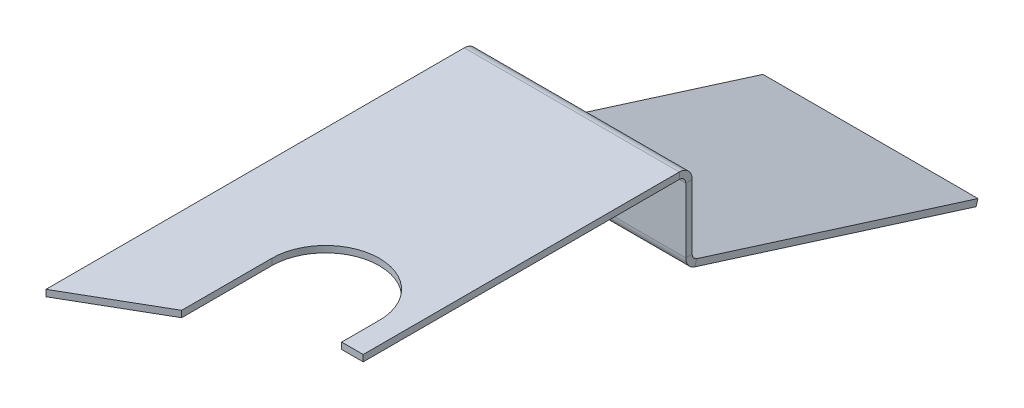
ISO-10303-21;
HEADER;
FILE_DESCRIPTION(('STEP AP214'),'2;1');
FILE_NAME('part.step','',(''),(''),'','','');
FILE_SCHEMA(('AUTOMOTIVE_DESIGN { 1 0 10303 214 1 1 1 1 }'));
ENDSEC;
DATA;
#1=APPLICATION_CONTEXT('core data for automotive mechanical design processes');
#2=APPLICATION_PROTOCOL_DEFINITION('international standard','automotive_design',2000,#1);
#3=PRODUCT_CONTEXT('',#1,'mechanical');
#4=PRODUCT('Part','Part','',(#3));
#5=PRODUCT_RELATED_PRODUCT_CATEGORY('part','',(#4));
#6=PRODUCT_DEFINITION_FORMATION('','',#4);
#7=PRODUCT_DEFINITION_CONTEXT('part definition',#1,'design');
#8=PRODUCT_DEFINITION('design','',#6,#7);
#9=PRODUCT_DEFINITION_SHAPE('','',#8);
#10=(LENGTH_UNIT() NAMED_UNIT(*) SI_UNIT(.MILLI.,.METRE.));
#11=(NAMED_UNIT(*) PLANE_ANGLE_UNIT() SI_UNIT($,.RADIAN.));
#12=(NAMED_UNIT(*) SI_UNIT($,.STERADIAN.) SOLID_ANGLE_UNIT());
#13=UNCERTAINTY_MEASURE_WITH_UNIT(LENGTH_MEASURE(1.E-05),#10,'distance_accuracy_value','');
#14=(GEOMETRIC_REPRESENTATION_CONTEXT(3) GLOBAL_UNCERTAINTY_ASSIGNED_CONTEXT((#13)) GLOBAL_UNIT_ASSIGNED_CONTEXT((#10,
#11,#12)) REPRESENTATION_CONTEXT('',''));
#15=CARTESIAN_POINT('',(0.,0.,0.));
#16=DIRECTION('',(0.,0.,1.));
#17=DIRECTION('',(1.,0.,0.));
#18=AXIS2_PLACEMENT_3D('',#15,#16,#17);
#19=CARTESIAN_POINT('',(100.,-6.,-401.));
#20=DIRECTION('',(1.,0.,0.));
#21=DIRECTION('',(0.,0.,-1.));
#22=AXIS2_PLACEMENT_3D('',#19,#20,#21);
#23=PLANE('',#22);
#24=DIRECTION('',(0.,0.,-1.));
#25=VECTOR('',#24,1.);
#26=CARTESIAN_POINT('',(100.,6.,0.));
#27=LINE('',#26,#25);
#28=CARTESIAN_POINT('',(100.,6.,-95.));
#29=VERTEX_POINT('',#28);
#30=CARTESIAN_POINT('',(100.,6.,-388.999999999999));
#31=VERTEX_POINT('',#30);
#32=EDGE_CURVE('E252',#29,#31,#27,.T.);
#33=ORIENTED_EDGE('',*,*,#32,.F.);
#34=DIRECTION('',(0.,-1.,0.));
#35=VECTOR('',#34,1.);
#36=CARTESIAN_POINT('',(100.,0.,-95.));
#37=LINE('',#36,#35);
#38=CARTESIAN_POINT('',(100.,0.,-95.));
#39=VERTEX_POINT('',#38);
#40=EDGE_CURVE('E263',#39,#29,#37,.F.);
#41=ORIENTED_EDGE('',*,*,#40,.F.);
#42=DIRECTION('',(0.,0.,-1.));
#43=VECTOR('',#42,1.);
#44=CARTESIAN_POINT('',(100.,0.,0.));
#45=LINE('',#44,#43);
#46=CARTESIAN_POINT('',(100.,0.,-389.));
#47=VERTEX_POINT('',#46);
#48=EDGE_CURVE('E151',#39,#47,#45,.T.);
#49=ORIENTED_EDGE('',*,*,#48,.T.);
#50=DIRECTION('',(0.,1.,0.));
#51=VECTOR('',#50,1.);
#52=CARTESIAN_POINT('',(100.,0.,-389.));
#53=LINE('',#52,#51);
#54=EDGE_CURVE('E11',#47,#31,#53,.T.);
#55=ORIENTED_EDGE('',*,*,#54,.T.);
#56=EDGE_LOOP('',(#33,#41,#49,#55));
#57=FACE_BOUND('',#56,.T.);
#58=ADVANCED_FACE('F38',(#57),#23,.T.);
#59=CARTESIAN_POINT('',(100.,6.,0.));
#60=DIRECTION('',(0.,1.,0.));
#61=DIRECTION('',(0.,0.,1.));
#62=AXIS2_PLACEMENT_3D('',#59,#60,#61);
#63=PLANE('',#62);
#64=DIRECTION('',(0.,0.,1.));
#65=VECTOR('',#64,1.);
#66=CARTESIAN_POINT('',(80.,6.,0.));
#67=LINE('',#66,#65);
#68=CARTESIAN_POINT('',(80.,6.,-130.));
#69=VERTEX_POINT('',#68);
#70=CARTESIAN_POINT('',(80.,6.,-95.));
#71=VERTEX_POINT('',#70);
#72=EDGE_CURVE('E305',#69,#71,#67,.T.);
#73=ORIENTED_EDGE('',*,*,#72,.T.);
#74=DIRECTION('',(1.,0.,0.));
#75=VECTOR('',#74,1.);
#76=CARTESIAN_POINT('',(100.,6.,-95.));
#77=LINE('',#76,#75);
#78=EDGE_CURVE('E299',#71,#29,#77,.T.);
#79=ORIENTED_EDGE('',*,*,#78,.T.);
#80=ORIENTED_EDGE('',*,*,#32,.T.);
#81=DIRECTION('',(-1.,0.,0.));
#82=VECTOR('',#81,1.);
#83=CARTESIAN_POINT('',(100.,6.,-388.999999999999));
#84=LINE('',#83,#82);
#85=CARTESIAN_POINT('',(-100.,6.,-388.999999999999));
#86=VERTEX_POINT('',#85);
#87=EDGE_CURVE('E207',#31,#86,#84,.T.);
#88=ORIENTED_EDGE('',*,*,#87,.T.);
#89=DIRECTION('',(0.,0.,-1.));
#90=VECTOR('',#89,1.);
#91=CARTESIAN_POINT('',(-100.,6.,0.));
#92=LINE('',#91,#90);
#93=CARTESIAN_POINT('',(-100.,6.,0.));
#94=VERTEX_POINT('',#93);
#95=EDGE_CURVE('E189',#94,#86,#92,.T.);
#96=ORIENTED_EDGE('',*,*,#95,.F.);
#97=DIRECTION('',(0.86602540378444,0.,-0.499999999999998));
#98=VECTOR('',#97,1.);
#99=CARTESIAN_POINT('',(-20.,6.,-46.1880215351698));
#100=LINE('',#99,#98);
#101=CARTESIAN_POINT('',(-20.,6.,-46.1880215351698));
#102=VERTEX_POINT('',#101);
#103=EDGE_CURVE('E312',#94,#102,#100,.T.);
#104=ORIENTED_EDGE('',*,*,#103,.T.);
#105=DIRECTION('',(0.,0.,1.));
#106=VECTOR('',#105,1.);
#107=CARTESIAN_POINT('',(-20.,6.,0.));
#108=LINE('',#107,#106);
#109=CARTESIAN_POINT('',(-20.,6.,-130.));
#110=VERTEX_POINT('',#109);
#111=EDGE_CURVE('E315',#102,#110,#108,.F.);
#112=ORIENTED_EDGE('',*,*,#111,.T.);
#113=CARTESIAN_POINT('',(30.,6.,-130.));
#114=DIRECTION('',(0.,1.,0.));
#115=DIRECTION('',(0.,0.,1.));
#116=AXIS2_PLACEMENT_3D('',#113,#114,#115);
#117=CIRCLE('',#116,50.);
#118=EDGE_CURVE('E309',#110,#69,#117,.F.);
#119=ORIENTED_EDGE('',*,*,#118,.T.);
#120=EDGE_LOOP('',(#73,#79,#80,#88,#96,#104,#112,#119));
#121=FACE_BOUND('',#120,.T.);
#122=ADVANCED_FACE('F248',(#121),#63,.T.);
#123=CARTESIAN_POINT('',(100.,0.,0.));
#124=DIRECTION('',(0.,1.,0.));
#125=DIRECTION('',(0.,0.,1.));
#126=AXIS2_PLACEMENT_3D('',#123,#124,#125);
#127=PLANE('',#126);
#128=DIRECTION('',(1.,0.,0.));
#129=VECTOR('',#128,1.);
#130=CARTESIAN_POINT('',(80.,0.,-95.));
#131=LINE('',#130,#129);
#132=CARTESIAN_POINT('',(80.,0.,-95.));
#133=VERTEX_POINT('',#132);
#134=EDGE_CURVE('E270',#133,#39,#131,.T.);
#135=ORIENTED_EDGE('',*,*,#134,.F.);
#136=DIRECTION('',(0.,0.,1.));
#137=VECTOR('',#136,1.);
#138=CARTESIAN_POINT('',(80.,0.,-130.));
#139=LINE('',#138,#137);
#140=CARTESIAN_POINT('',(80.,0.,-130.));
#141=VERTEX_POINT('',#140);
#142=EDGE_CURVE('E324',#141,#133,#139,.T.);
#143=ORIENTED_EDGE('',*,*,#142,.F.);
#144=CARTESIAN_POINT('',(30.,0.,-130.));
#145=DIRECTION('',(0.,1.,0.));
#146=DIRECTION('',(0.,0.,1.));
#147=AXIS2_PLACEMENT_3D('',#144,#145,#146);
#148=CIRCLE('',#147,50.);
#149=CARTESIAN_POINT('',(-20.,0.,-130.));
#150=VERTEX_POINT('',#149);
#151=EDGE_CURVE('E322',#150,#141,#148,.F.);
#152=ORIENTED_EDGE('',*,*,#151,.F.);
#153=DIRECTION('',(0.,0.,-1.));
#154=VECTOR('',#153,1.);
#155=CARTESIAN_POINT('',(-20.,0.,-130.));
#156=LINE('',#155,#154);
#157=CARTESIAN_POINT('',(-20.,0.,-46.1880215351698));
#158=VERTEX_POINT('',#157);
#159=EDGE_CURVE('E320',#158,#150,#156,.T.);
#160=ORIENTED_EDGE('',*,*,#159,.F.);
#161=DIRECTION('',(0.86602540378444,0.,-0.499999999999998));
#162=VECTOR('',#161,1.);
#163=CARTESIAN_POINT('',(-20.,0.,-46.1880215351698));
#164=LINE('',#163,#162);
#165=CARTESIAN_POINT('',(-100.,0.,0.));
#166=VERTEX_POINT('',#165);
#167=EDGE_CURVE('E318',#166,#158,#164,.T.);
#168=ORIENTED_EDGE('',*,*,#167,.F.);
#169=DIRECTION('',(0.,0.,-1.));
#170=VECTOR('',#169,1.);
#171=CARTESIAN_POINT('',(-100.,0.,0.));
#172=LINE('',#171,#170);
#173=CARTESIAN_POINT('',(-100.,0.,-389.));
#174=VERTEX_POINT('',#173);
#175=EDGE_CURVE('E195',#166,#174,#172,.T.);
#176=ORIENTED_EDGE('',*,*,#175,.T.);
#177=DIRECTION('',(-1.,0.,0.));
#178=VECTOR('',#177,1.);
#179=CARTESIAN_POINT('',(100.,0.,-389.));
#180=LINE('',#179,#178);
#181=EDGE_CURVE('E160',#47,#174,#180,.T.);
#182=ORIENTED_EDGE('',*,*,#181,.F.);
#183=ORIENTED_EDGE('',*,*,#48,.F.);
#184=EDGE_LOOP('',(#135,#143,#152,#160,#168,#176,#182,#183));
#185=FACE_BOUND('',#184,.T.);
#186=ADVANCED_FACE('F266',(#185),#127,.F.);
#187=CARTESIAN_POINT('',(100.,0.,-389.));
#188=DIRECTION('',(1.,0.,0.));
#189=DIRECTION('',(0.,0.,-1.));
#190=AXIS2_PLACEMENT_3D('',#187,#188,#189);
#191=PLANE('',#190);
#192=ORIENTED_EDGE('',*,*,#54,.F.);
#193=CARTESIAN_POINT('',(100.,-6.,-389.));
#194=DIRECTION('',(1.,0.,0.));
#195=DIRECTION('',(0.,0.,-1.));
#196=AXIS2_PLACEMENT_3D('',#193,#194,#195);
#197=CIRCLE('',#196,6.);
#198=CARTESIAN_POINT('',(100.,-6.,-395.));
#199=VERTEX_POINT('',#198);
#200=EDGE_CURVE('E146',#47,#199,#197,.F.);
#201=ORIENTED_EDGE('',*,*,#200,.T.);
#202=DIRECTION('',(0.,0.,1.));
#203=VECTOR('',#202,1.);
#204=CARTESIAN_POINT('',(100.,-6.,-401.));
#205=LINE('',#204,#203);
#206=CARTESIAN_POINT('',(100.,-6.,-401.));
#207=VERTEX_POINT('',#206);
#208=EDGE_CURVE('E47',#207,#199,#205,.T.);
#209=ORIENTED_EDGE('',*,*,#208,.F.);
#210=CARTESIAN_POINT('',(100.,-6.,-389.));
#211=DIRECTION('',(1.,0.,0.));
#212=DIRECTION('',(0.,0.,-1.));
#213=AXIS2_PLACEMENT_3D('',#210,#211,#212);
#214=CIRCLE('',#213,12.);
#215=EDGE_CURVE('E237',#31,#207,#214,.F.);
#216=ORIENTED_EDGE('',*,*,#215,.F.);
#217=EDGE_LOOP('',(#192,#201,#209,#216));
#218=FACE_BOUND('',#217,.T.);
#219=ADVANCED_FACE('F40',(#218),#191,.T.);
#220=CARTESIAN_POINT('',(-100.,-6.,-395.));
#221=DIRECTION('',(-1.,0.,0.));
#222=DIRECTION('',(0.,0.,1.));
#223=AXIS2_PLACEMENT_3D('',#220,#221,#222);
#224=PLANE('',#223);
#225=DIRECTION('',(0.,0.,-1.));
#226=VECTOR('',#225,1.);
#227=CARTESIAN_POINT('',(-100.,-6.,-395.));
#228=LINE('',#227,#226);
#229=CARTESIAN_POINT('',(-100.,-6.,-395.));
#230=VERTEX_POINT('',#229);
#231=CARTESIAN_POINT('',(-100.,-6.,-401.));
#232=VERTEX_POINT('',#231);
#233=EDGE_CURVE('E143',#230,#232,#228,.T.);
#234=ORIENTED_EDGE('',*,*,#233,.F.);
#235=CARTESIAN_POINT('',(-100.,-6.,-389.));
#236=DIRECTION('',(1.,0.,0.));
#237=DIRECTION('',(0.,0.,-1.));
#238=AXIS2_PLACEMENT_3D('',#235,#236,#237);
#239=CIRCLE('',#238,6.);
#240=EDGE_CURVE('E158',#174,#230,#239,.F.);
#241=ORIENTED_EDGE('',*,*,#240,.F.);
#242=DIRECTION('',(0.,-1.,0.));
#243=VECTOR('',#242,1.);
#244=CARTESIAN_POINT('',(-100.,6.,-388.999999999999));
#245=LINE('',#244,#243);
#246=EDGE_CURVE('E228',#86,#174,#245,.T.);
#247=ORIENTED_EDGE('',*,*,#246,.F.);
#248=CARTESIAN_POINT('',(-100.,-6.,-389.));
#249=DIRECTION('',(1.,0.,0.));
#250=DIRECTION('',(0.,0.,-1.));
#251=AXIS2_PLACEMENT_3D('',#248,#249,#250);
#252=CIRCLE('',#251,12.);
#253=EDGE_CURVE('E186',#86,#232,#252,.F.);
#254=ORIENTED_EDGE('',*,*,#253,.T.);
#255=EDGE_LOOP('',(#234,#241,#247,#254));
#256=FACE_BOUND('',#255,.T.);
#257=ADVANCED_FACE('F242',(#256),#224,.T.);
#258=CARTESIAN_POINT('',(-100.,6.,-388.999999999999));
#259=DIRECTION('',(-1.,0.,0.));
#260=DIRECTION('',(0.,0.,1.));
#261=AXIS2_PLACEMENT_3D('',#258,#259,#260);
#262=PLANE('',#261);
#263=DIRECTION('',(0.,-1.,0.));
#264=VECTOR('',#263,1.);
#265=CARTESIAN_POINT('',(-100.,0.,-395.));
#266=LINE('',#265,#264);
#267=CARTESIAN_POINT('',(-100.,-66.1971734624727,-395.));
#268=VERTEX_POINT('',#267);
#269=EDGE_CURVE('E199',#230,#268,#266,.T.);
#270=ORIENTED_EDGE('',*,*,#269,.F.);
#271=ORIENTED_EDGE('',*,*,#233,.T.);
#272=DIRECTION('',(0.,1.,0.));
#273=VECTOR('',#272,1.);
#274=CARTESIAN_POINT('',(-100.,0.,-401.));
#275=LINE('',#274,#273);
#276=CARTESIAN_POINT('',(-100.,-66.1971734624727,-401.));
#277=VERTEX_POINT('',#276);
#278=EDGE_CURVE('E184',#232,#277,#275,.F.);
#279=ORIENTED_EDGE('',*,*,#278,.T.);
#280=DIRECTION('',(0.,0.,1.));
#281=VECTOR('',#280,1.);
#282=CARTESIAN_POINT('',(-100.,-66.1971734624727,-401.));
#283=LINE('',#282,#281);
#284=EDGE_CURVE('E94',#277,#268,#283,.T.);
#285=ORIENTED_EDGE('',*,*,#284,.T.);
#286=EDGE_LOOP('',(#270,#271,#279,#285));
#287=FACE_BOUND('',#286,.T.);
#288=ADVANCED_FACE('F230',(#287),#262,.T.);
#289=CARTESIAN_POINT('',(100.,-66.1971734624727,-395.));
#290=DIRECTION('',(1.,0.,0.));
#291=DIRECTION('',(0.,0.,-1.));
#292=AXIS2_PLACEMENT_3D('',#289,#290,#291);
#293=PLANE('',#292);
#294=DIRECTION('',(0.,0.,-1.));
#295=VECTOR('',#294,1.);
#296=CARTESIAN_POINT('',(100.,-66.1971734624727,-395.));
#297=LINE('',#296,#295);
#298=CARTESIAN_POINT('',(100.,-66.1971734624727,-395.));
#299=VERTEX_POINT('',#298);
#300=CARTESIAN_POINT('',(100.,-66.1971734624727,-401.));
#301=VERTEX_POINT('',#300);
#302=EDGE_CURVE('E226',#299,#301,#297,.T.);
#303=ORIENTED_EDGE('',*,*,#302,.F.);
#304=CARTESIAN_POINT('',(100.,-66.1971734624727,-407.));
#305=DIRECTION('',(-1.,0.,0.));
#306=DIRECTION('',(0.,0.,1.));
#307=AXIS2_PLACEMENT_3D('',#304,#305,#306);
#308=CIRCLE('',#307,12.);
#309=CARTESIAN_POINT('',(100.,-77.6433644713431,-403.396569497208));
#310=VERTEX_POINT('',#309);
#311=EDGE_CURVE('E166',#299,#310,#308,.F.);
#312=ORIENTED_EDGE('',*,*,#311,.T.);
#313=DIRECTION('',(0.,-0.953849250739195,0.300285875232712));
#314=VECTOR('',#313,1.);
#315=CARTESIAN_POINT('',(100.,-71.9202689669079,-405.198284748604));
#316=LINE('',#315,#314);
#317=CARTESIAN_POINT('',(100.,-71.9202689669079,-405.198284748604));
#318=VERTEX_POINT('',#317);
#319=EDGE_CURVE('E55',#318,#310,#316,.T.);
#320=ORIENTED_EDGE('',*,*,#319,.F.);
#321=CARTESIAN_POINT('',(100.,-66.1971734624727,-407.));
#322=DIRECTION('',(1.,0.,0.));
#323=DIRECTION('',(0.,0.,-1.));
#324=AXIS2_PLACEMENT_3D('',#321,#322,#323);
#325=CIRCLE('',#324,6.);
#326=EDGE_CURVE('E255',#301,#318,#325,.T.);
#327=ORIENTED_EDGE('',*,*,#326,.F.);
#328=EDGE_LOOP('',(#303,#312,#320,#327));
#329=FACE_BOUND('',#328,.T.);
#330=ADVANCED_FACE('F346',(#329),#293,.T.);
#331=CARTESIAN_POINT('',(100.,-71.9202689669079,-405.198284748604));
#332=DIRECTION('',(1.,0.,0.));
#333=DIRECTION('',(0.,0.,-1.));
#334=AXIS2_PLACEMENT_3D('',#331,#332,#333);
#335=PLANE('',#334);
#336=DIRECTION('',(0.,-1.,0.));
#337=VECTOR('',#336,1.);
#338=CARTESIAN_POINT('',(100.,0.,-395.));
#339=LINE('',#338,#337);
#340=EDGE_CURVE('E135',#199,#299,#339,.T.);
#341=ORIENTED_EDGE('',*,*,#340,.T.);
#342=ORIENTED_EDGE('',*,*,#302,.T.);
#343=DIRECTION('',(0.,1.,0.));
#344=VECTOR('',#343,1.);
#345=CARTESIAN_POINT('',(100.,0.,-401.));
#346=LINE('',#345,#344);
#347=EDGE_CURVE('E138',#207,#301,#346,.F.);
#348=ORIENTED_EDGE('',*,*,#347,.F.);
#349=ORIENTED_EDGE('',*,*,#208,.T.);
#350=EDGE_LOOP('',(#341,#342,#348,#349));
#351=FACE_BOUND('',#350,.T.);
#352=ADVANCED_FACE('F133',(#351),#335,.T.);
#353=CARTESIAN_POINT('',(-100.,-77.6433644713431,-403.396569497208));
#354=DIRECTION('',(-1.,0.,0.));
#355=DIRECTION('',(0.,0.,1.));
#356=AXIS2_PLACEMENT_3D('',#353,#354,#355);
#357=PLANE('',#356);
#358=DIRECTION('',(0.,0.953849250739195,-0.300285875232712));
#359=VECTOR('',#358,1.);
#360=CARTESIAN_POINT('',(-100.,-77.6433644713431,-403.396569497208));
#361=LINE('',#360,#359);
#362=CARTESIAN_POINT('',(-100.,-77.6433644713431,-403.396569497208));
#363=VERTEX_POINT('',#362);
#364=CARTESIAN_POINT('',(-100.,-71.9202689669079,-405.198284748604));
#365=VERTEX_POINT('',#364);
#366=EDGE_CURVE('E101',#363,#365,#361,.T.);
#367=ORIENTED_EDGE('',*,*,#366,.F.);
#368=CARTESIAN_POINT('',(-100.,-66.1971734624727,-407.));
#369=DIRECTION('',(-1.,0.,0.));
#370=DIRECTION('',(0.,0.,1.));
#371=AXIS2_PLACEMENT_3D('',#368,#369,#370);
#372=CIRCLE('',#371,12.);
#373=EDGE_CURVE('E201',#268,#363,#372,.F.);
#374=ORIENTED_EDGE('',*,*,#373,.F.);
#375=ORIENTED_EDGE('',*,*,#284,.F.);
#376=CARTESIAN_POINT('',(-100.,-66.1971734624727,-407.));
#377=DIRECTION('',(1.,0.,0.));
#378=DIRECTION('',(0.,0.,-1.));
#379=AXIS2_PLACEMENT_3D('',#376,#377,#378);
#380=CIRCLE('',#379,6.);
#381=EDGE_CURVE('E182',#277,#365,#380,.T.);
#382=ORIENTED_EDGE('',*,*,#381,.T.);
#383=EDGE_LOOP('',(#367,#374,#375,#382));
#384=FACE_BOUND('',#383,.T.);
#385=ADVANCED_FACE('F361',(#384),#357,.T.);
#386=CARTESIAN_POINT('',(-100.,-66.1971734624727,-401.));
#387=DIRECTION('',(-1.,0.,0.));
#388=DIRECTION('',(0.,0.,1.));
#389=AXIS2_PLACEMENT_3D('',#386,#387,#388);
#390=PLANE('',#389);
#391=DIRECTION('',(0.,-0.30028587523271,-0.953849250739196));
#392=VECTOR('',#391,1.);
#393=CARTESIAN_POINT('',(-100.,-75.,-395.));
#394=LINE('',#393,#392);
#395=CARTESIAN_POINT('',(-100.,-160.,-665.));
#396=VERTEX_POINT('',#395);
#397=EDGE_CURVE('E172',#363,#396,#394,.T.);
#398=ORIENTED_EDGE('',*,*,#397,.F.);
#399=ORIENTED_EDGE('',*,*,#366,.T.);
#400=DIRECTION('',(0.,-0.30028587523271,-0.953849250739196));
#401=VECTOR('',#400,1.);
#402=CARTESIAN_POINT('',(-100.,-69.2769044955648,-396.801715251396));
#403=LINE('',#402,#401);
#404=CARTESIAN_POINT('',(-100.,-154.276904495565,-666.801715251396));
#405=VERTEX_POINT('',#404);
#406=EDGE_CURVE('E179',#365,#405,#403,.T.);
#407=ORIENTED_EDGE('',*,*,#406,.T.);
#408=DIRECTION('',(0.,-0.953849250739195,0.300285875232714));
#409=VECTOR('',#408,1.);
#410=CARTESIAN_POINT('',(-100.,-154.276904495565,-666.801715251396));
#411=LINE('',#410,#409);
#412=EDGE_CURVE('E175',#405,#396,#411,.T.);
#413=ORIENTED_EDGE('',*,*,#412,.T.);
#414=EDGE_LOOP('',(#398,#399,#407,#413));
#415=FACE_BOUND('',#414,.T.);
#416=ADVANCED_FACE('F356',(#415),#390,.T.);
#417=CARTESIAN_POINT('',(100.,-75.,-395.));
#418=DIRECTION('',(0.,0.953849250739196,-0.30028587523271));
#419=DIRECTION('',(0.,0.30028587523271,0.953849250739196));
#420=AXIS2_PLACEMENT_3D('',#417,#418,#419);
#421=PLANE('',#420);
#422=ORIENTED_EDGE('',*,*,#397,.T.);
#423=DIRECTION('',(-1.,0.,0.));
#424=VECTOR('',#423,1.);
#425=CARTESIAN_POINT('',(100.,-160.,-665.));
#426=LINE('',#425,#424);
#427=CARTESIAN_POINT('',(100.,-160.,-665.));
#428=VERTEX_POINT('',#427);
#429=EDGE_CURVE('E221',#428,#396,#426,.T.);
#430=ORIENTED_EDGE('',*,*,#429,.F.);
#431=DIRECTION('',(0.,-0.30028587523271,-0.953849250739196));
#432=VECTOR('',#431,1.);
#433=CARTESIAN_POINT('',(100.,-75.,-395.));
#434=LINE('',#433,#432);
#435=EDGE_CURVE('E107',#310,#428,#434,.T.);
#436=ORIENTED_EDGE('',*,*,#435,.F.);
#437=DIRECTION('',(-1.,0.,0.));
#438=VECTOR('',#437,1.);
#439=CARTESIAN_POINT('',(100.,-77.6433644713431,-403.396569497208));
#440=LINE('',#439,#438);
#441=EDGE_CURVE('E168',#310,#363,#440,.T.);
#442=ORIENTED_EDGE('',*,*,#441,.T.);
#443=EDGE_LOOP('',(#422,#430,#436,#442));
#444=FACE_BOUND('',#443,.T.);
#445=ADVANCED_FACE('F358',(#444),#421,.F.);
#446=CARTESIAN_POINT('',(100.,-154.276904495565,-666.801715251396));
#447=DIRECTION('',(0.,-0.300285875232714,-0.953849250739195));
#448=DIRECTION('',(0.,0.953849250739195,-0.300285875232714));
#449=AXIS2_PLACEMENT_3D('',#446,#447,#448);
#450=PLANE('',#449);
#451=ORIENTED_EDGE('',*,*,#412,.F.);
#452=DIRECTION('',(-1.,0.,0.));
#453=VECTOR('',#452,1.);
#454=CARTESIAN_POINT('',(100.,-154.276904495565,-666.801715251396));
#455=LINE('',#454,#453);
#456=CARTESIAN_POINT('',(100.,-154.276904495565,-666.801715251396));
#457=VERTEX_POINT('',#456);
#458=EDGE_CURVE('E219',#457,#405,#455,.T.);
#459=ORIENTED_EDGE('',*,*,#458,.F.);
#460=DIRECTION('',(0.,-0.953849250739195,0.300285875232714));
#461=VECTOR('',#460,1.);
#462=CARTESIAN_POINT('',(100.,-154.276904495565,-666.801715251396));
#463=LINE('',#462,#461);
#464=EDGE_CURVE('E334',#457,#428,#463,.T.);
#465=ORIENTED_EDGE('',*,*,#464,.T.);
#466=ORIENTED_EDGE('',*,*,#429,.T.);
#467=EDGE_LOOP('',(#451,#459,#465,#466));
#468=FACE_BOUND('',#467,.T.);
#469=ADVANCED_FACE('F353',(#468),#450,.T.);
#470=CARTESIAN_POINT('',(100.,-69.2769044955648,-396.801715251396));
#471=DIRECTION('',(0.,0.953849250739196,-0.30028587523271));
#472=DIRECTION('',(0.,0.30028587523271,0.953849250739196));
#473=AXIS2_PLACEMENT_3D('',#470,#471,#472);
#474=PLANE('',#473);
#475=ORIENTED_EDGE('',*,*,#406,.F.);
#476=DIRECTION('',(-1.,0.,0.));
#477=VECTOR('',#476,1.);
#478=CARTESIAN_POINT('',(100.,-71.9202689669079,-405.198284748604));
#479=LINE('',#478,#477);
#480=EDGE_CURVE('E216',#318,#365,#479,.T.);
#481=ORIENTED_EDGE('',*,*,#480,.F.);
#482=DIRECTION('',(0.,-0.30028587523271,-0.953849250739196));
#483=VECTOR('',#482,1.);
#484=CARTESIAN_POINT('',(100.,-69.2769044955648,-396.801715251396));
#485=LINE('',#484,#483);
#486=EDGE_CURVE('E337',#318,#457,#485,.T.);
#487=ORIENTED_EDGE('',*,*,#486,.T.);
#488=ORIENTED_EDGE('',*,*,#458,.T.);
#489=EDGE_LOOP('',(#475,#481,#487,#488));
#490=FACE_BOUND('',#489,.T.);
#491=ADVANCED_FACE('F349',(#490),#474,.T.);
#492=CARTESIAN_POINT('',(100.,-66.1971734624727,-407.));
#493=DIRECTION('',(-1.,0.,0.));
#494=DIRECTION('',(0.,0.,1.));
#495=AXIS2_PLACEMENT_3D('',#492,#493,#494);
#496=CYLINDRICAL_SURFACE('',#495,6.);
#497=ORIENTED_EDGE('',*,*,#381,.F.);
#498=DIRECTION('',(-1.,0.,0.));
#499=VECTOR('',#498,1.);
#500=CARTESIAN_POINT('',(100.,-66.1971734624727,-401.));
#501=LINE('',#500,#499);
#502=EDGE_CURVE('E213',#301,#277,#501,.T.);
#503=ORIENTED_EDGE('',*,*,#502,.F.);
#504=ORIENTED_EDGE('',*,*,#326,.T.);
#505=ORIENTED_EDGE('',*,*,#480,.T.);
#506=EDGE_LOOP('',(#497,#503,#504,#505));
#507=FACE_BOUND('',#506,.T.);
#508=ADVANCED_FACE('F342',(#507),#496,.F.);
#509=CARTESIAN_POINT('',(100.,0.,-401.));
#510=DIRECTION('',(0.,0.,-1.));
#511=DIRECTION('',(-1.,0.,0.));
#512=AXIS2_PLACEMENT_3D('',#509,#510,#511);
#513=PLANE('',#512);
#514=ORIENTED_EDGE('',*,*,#278,.F.);
#515=DIRECTION('',(-1.,0.,0.));
#516=VECTOR('',#515,1.);
#517=CARTESIAN_POINT('',(100.,-6.,-401.));
#518=LINE('',#517,#516);
#519=EDGE_CURVE('E210',#207,#232,#518,.T.);
#520=ORIENTED_EDGE('',*,*,#519,.F.);
#521=ORIENTED_EDGE('',*,*,#347,.T.);
#522=ORIENTED_EDGE('',*,*,#502,.T.);
#523=EDGE_LOOP('',(#514,#520,#521,#522));
#524=FACE_BOUND('',#523,.T.);
#525=ADVANCED_FACE('F239',(#524),#513,.T.);
#526=CARTESIAN_POINT('',(100.,-6.,-389.));
#527=DIRECTION('',(-1.,0.,0.));
#528=DIRECTION('',(0.,0.,1.));
#529=AXIS2_PLACEMENT_3D('',#526,#527,#528);
#530=CYLINDRICAL_SURFACE('',#529,12.);
#531=ORIENTED_EDGE('',*,*,#253,.F.);
#532=ORIENTED_EDGE('',*,*,#87,.F.);
#533=ORIENTED_EDGE('',*,*,#215,.T.);
#534=ORIENTED_EDGE('',*,*,#519,.T.);
#535=EDGE_LOOP('',(#531,#532,#533,#534));
#536=FACE_BOUND('',#535,.T.);
#537=ADVANCED_FACE('F235',(#536),#530,.T.);
#538=CARTESIAN_POINT('',(100.,-6.,-389.));
#539=DIRECTION('',(-1.,0.,0.));
#540=DIRECTION('',(0.,0.,1.));
#541=AXIS2_PLACEMENT_3D('',#538,#539,#540);
#542=CYLINDRICAL_SURFACE('',#541,6.);
#543=ORIENTED_EDGE('',*,*,#240,.T.);
#544=DIRECTION('',(-1.,0.,0.));
#545=VECTOR('',#544,1.);
#546=CARTESIAN_POINT('',(100.,-6.,-395.));
#547=LINE('',#546,#545);
#548=EDGE_CURVE('E155',#199,#230,#547,.T.);
#549=ORIENTED_EDGE('',*,*,#548,.F.);
#550=ORIENTED_EDGE('',*,*,#200,.F.);
#551=ORIENTED_EDGE('',*,*,#181,.T.);
#552=EDGE_LOOP('',(#543,#549,#550,#551));
#553=FACE_BOUND('',#552,.T.);
#554=ADVANCED_FACE('F156',(#553),#542,.F.);
#555=CARTESIAN_POINT('',(100.,0.,-395.));
#556=DIRECTION('',(0.,0.,-1.));
#557=DIRECTION('',(-1.,0.,0.));
#558=AXIS2_PLACEMENT_3D('',#555,#556,#557);
#559=PLANE('',#558);
#560=ORIENTED_EDGE('',*,*,#269,.T.);
#561=DIRECTION('',(-1.,0.,0.));
#562=VECTOR('',#561,1.);
#563=CARTESIAN_POINT('',(100.,-66.1971734624727,-395.));
#564=LINE('',#563,#562);
#565=EDGE_CURVE('E161',#299,#268,#564,.T.);
#566=ORIENTED_EDGE('',*,*,#565,.F.);
#567=ORIENTED_EDGE('',*,*,#340,.F.);
#568=ORIENTED_EDGE('',*,*,#548,.T.);
#569=EDGE_LOOP('',(#560,#566,#567,#568));
#570=FACE_BOUND('',#569,.T.);
#571=ADVANCED_FACE('F163',(#570),#559,.F.);
#572=CARTESIAN_POINT('',(100.,-66.1971734624727,-407.));
#573=DIRECTION('',(-1.,0.,0.));
#574=DIRECTION('',(0.,0.,1.));
#575=AXIS2_PLACEMENT_3D('',#572,#573,#574);
#576=CYLINDRICAL_SURFACE('',#575,12.);
#577=ORIENTED_EDGE('',*,*,#373,.T.);
#578=ORIENTED_EDGE('',*,*,#441,.F.);
#579=ORIENTED_EDGE('',*,*,#311,.F.);
#580=ORIENTED_EDGE('',*,*,#565,.T.);
#581=EDGE_LOOP('',(#577,#578,#579,#580));
#582=FACE_BOUND('',#581,.T.);
#583=ADVANCED_FACE('F360',(#582),#576,.T.);
#584=CARTESIAN_POINT('',(100.,-66.1971734624727,-407.));
#585=DIRECTION('',(1.,0.,0.));
#586=DIRECTION('',(0.,0.,-1.));
#587=AXIS2_PLACEMENT_3D('',#584,#585,#586);
#588=PLANE('',#587);
#589=ORIENTED_EDGE('',*,*,#435,.T.);
#590=ORIENTED_EDGE('',*,*,#464,.F.);
#591=ORIENTED_EDGE('',*,*,#486,.F.);
#592=ORIENTED_EDGE('',*,*,#319,.T.);
#593=EDGE_LOOP('',(#589,#590,#591,#592));
#594=FACE_BOUND('',#593,.T.);
#595=ADVANCED_FACE('F350',(#594),#588,.T.);
#596=CARTESIAN_POINT('',(-100.,-66.1971734624727,-407.));
#597=DIRECTION('',(1.,0.,0.));
#598=DIRECTION('',(0.,0.,-1.));
#599=AXIS2_PLACEMENT_3D('',#596,#597,#598);
#600=PLANE('',#599);
#601=ORIENTED_EDGE('',*,*,#95,.T.);
#602=ORIENTED_EDGE('',*,*,#246,.T.);
#603=ORIENTED_EDGE('',*,*,#175,.F.);
#604=DIRECTION('',(0.,1.,0.));
#605=VECTOR('',#604,1.);
#606=CARTESIAN_POINT('',(-100.,0.,0.));
#607=LINE('',#606,#605);
#608=EDGE_CURVE('E192',#166,#94,#607,.T.);
#609=ORIENTED_EDGE('',*,*,#608,.T.);
#610=EDGE_LOOP('',(#601,#602,#603,#609));
#611=FACE_BOUND('',#610,.T.);
#612=ADVANCED_FACE('F491',(#611),#600,.F.);
#613=CARTESIAN_POINT('',(30.,0.,-130.));
#614=DIRECTION('',(0.,1.,0.));
#615=DIRECTION('',(0.,0.,1.));
#616=AXIS2_PLACEMENT_3D('',#613,#614,#615);
#617=CYLINDRICAL_SURFACE('',#616,50.);
#618=DIRECTION('',(0.,-1.,0.));
#619=VECTOR('',#618,1.);
#620=CARTESIAN_POINT('',(-20.,0.,-130.));
#621=LINE('',#620,#619);
#622=EDGE_CURVE('E176',#150,#110,#621,.F.);
#623=ORIENTED_EDGE('',*,*,#622,.F.);
#624=ORIENTED_EDGE('',*,*,#151,.T.);
#625=DIRECTION('',(0.,-1.,0.));
#626=VECTOR('',#625,1.);
#627=CARTESIAN_POINT('',(80.,0.,-130.));
#628=LINE('',#627,#626);
#629=EDGE_CURVE('E328',#141,#69,#628,.F.);
#630=ORIENTED_EDGE('',*,*,#629,.T.);
#631=ORIENTED_EDGE('',*,*,#118,.F.);
#632=EDGE_LOOP('',(#623,#624,#630,#631));
#633=FACE_BOUND('',#632,.T.);
#634=ADVANCED_FACE('F523',(#633),#617,.F.);
#635=CARTESIAN_POINT('',(80.,0.,-130.));
#636=DIRECTION('',(-1.,0.,0.));
#637=DIRECTION('',(0.,0.,1.));
#638=AXIS2_PLACEMENT_3D('',#635,#636,#637);
#639=PLANE('',#638);
#640=ORIENTED_EDGE('',*,*,#629,.F.);
#641=ORIENTED_EDGE('',*,*,#142,.T.);
#642=DIRECTION('',(0.,-1.,0.));
#643=VECTOR('',#642,1.);
#644=CARTESIAN_POINT('',(80.,0.,-95.));
#645=LINE('',#644,#643);
#646=EDGE_CURVE('E301',#133,#71,#645,.F.);
#647=ORIENTED_EDGE('',*,*,#646,.T.);
#648=ORIENTED_EDGE('',*,*,#72,.F.);
#649=EDGE_LOOP('',(#640,#641,#647,#648));
#650=FACE_BOUND('',#649,.T.);
#651=ADVANCED_FACE('F533',(#650),#639,.T.);
#652=CARTESIAN_POINT('',(80.,0.,-95.));
#653=DIRECTION('',(0.,0.,1.));
#654=DIRECTION('',(1.,0.,0.));
#655=AXIS2_PLACEMENT_3D('',#652,#653,#654);
#656=PLANE('',#655);
#657=ORIENTED_EDGE('',*,*,#646,.F.);
#658=ORIENTED_EDGE('',*,*,#134,.T.);
#659=ORIENTED_EDGE('',*,*,#40,.T.);
#660=ORIENTED_EDGE('',*,*,#78,.F.);
#661=EDGE_LOOP('',(#657,#658,#659,#660));
#662=FACE_BOUND('',#661,.T.);
#663=ADVANCED_FACE('F298',(#662),#656,.T.);
#664=CARTESIAN_POINT('',(-20.,0.,-46.1880215351698));
#665=DIRECTION('',(0.499999999999998,0.,0.86602540378444));
#666=DIRECTION('',(0.86602540378444,0.,-0.499999999999998));
#667=AXIS2_PLACEMENT_3D('',#664,#665,#666);
#668=PLANE('',#667);
#669=ORIENTED_EDGE('',*,*,#608,.F.);
#670=ORIENTED_EDGE('',*,*,#167,.T.);
#671=DIRECTION('',(0.,-1.,0.));
#672=VECTOR('',#671,1.);
#673=CARTESIAN_POINT('',(-20.,0.,-46.1880215351698));
#674=LINE('',#673,#672);
#675=EDGE_CURVE('E302',#158,#102,#674,.F.);
#676=ORIENTED_EDGE('',*,*,#675,.T.);
#677=ORIENTED_EDGE('',*,*,#103,.F.);
#678=EDGE_LOOP('',(#669,#670,#676,#677));
#679=FACE_BOUND('',#678,.T.);
#680=ADVANCED_FACE('F553',(#679),#668,.T.);
#681=CARTESIAN_POINT('',(-20.,0.,-130.));
#682=DIRECTION('',(1.,0.,0.));
#683=DIRECTION('',(0.,0.,-1.));
#684=AXIS2_PLACEMENT_3D('',#681,#682,#683);
#685=PLANE('',#684);
#686=ORIENTED_EDGE('',*,*,#159,.T.);
#687=ORIENTED_EDGE('',*,*,#622,.T.);
#688=ORIENTED_EDGE('',*,*,#111,.F.);
#689=ORIENTED_EDGE('',*,*,#675,.F.);
#690=EDGE_LOOP('',(#686,#687,#688,#689));
#691=FACE_BOUND('',#690,.T.);
#692=ADVANCED_FACE('F563',(#691),#685,.T.);
#693=CLOSED_SHELL('',(#58,#122,#186,#219,#257,#288,#330,#352,#385,#416,#445,#469,#491,#508,#525,
#537,#554,#571,#583,#595,#612,#634,#651,#663,#680,#692));
#694=MANIFOLD_SOLID_BREP('B2',#693);
#695=ADVANCED_BREP_SHAPE_REPRESENTATION('',(#18,#694),#14);
#696=SHAPE_DEFINITION_REPRESENTATION(#9,#695);
ENDSEC;
END-ISO-10303-21;
